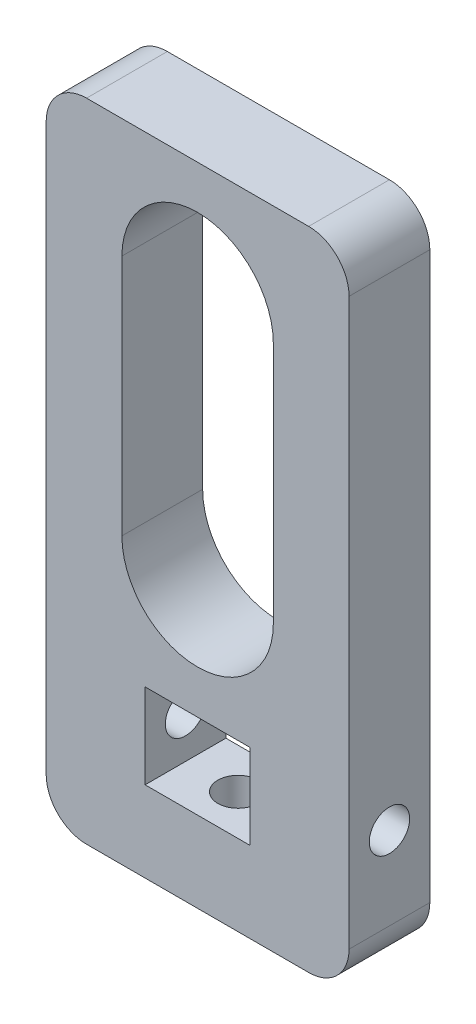
ISO-10303-21;
HEADER;
FILE_DESCRIPTION(('STEP AP214'),'2;1');
FILE_NAME('part.step','',(''),(''),'','','');
FILE_SCHEMA(('AUTOMOTIVE_DESIGN { 1 0 10303 214 1 1 1 1 }'));
ENDSEC;
DATA;
#1=APPLICATION_CONTEXT('core data for automotive mechanical design processes');
#2=APPLICATION_PROTOCOL_DEFINITION('international standard','automotive_design',2000,#1);
#3=PRODUCT_CONTEXT('',#1,'mechanical');
#4=PRODUCT('Part','Part','',(#3));
#5=PRODUCT_RELATED_PRODUCT_CATEGORY('part','',(#4));
#6=PRODUCT_DEFINITION_FORMATION('','',#4);
#7=PRODUCT_DEFINITION_CONTEXT('part definition',#1,'design');
#8=PRODUCT_DEFINITION('design','',#6,#7);
#9=PRODUCT_DEFINITION_SHAPE('','',#8);
#10=(LENGTH_UNIT() NAMED_UNIT(*) SI_UNIT(.MILLI.,.METRE.));
#11=(NAMED_UNIT(*) PLANE_ANGLE_UNIT() SI_UNIT($,.RADIAN.));
#12=(NAMED_UNIT(*) SI_UNIT($,.STERADIAN.) SOLID_ANGLE_UNIT());
#13=UNCERTAINTY_MEASURE_WITH_UNIT(LENGTH_MEASURE(1.E-05),#10,'distance_accuracy_value','');
#14=(GEOMETRIC_REPRESENTATION_CONTEXT(3) GLOBAL_UNCERTAINTY_ASSIGNED_CONTEXT((#13)) GLOBAL_UNIT_ASSIGNED_CONTEXT((#10,
#11,#12)) REPRESENTATION_CONTEXT('',''));
#15=CARTESIAN_POINT('',(0.,0.,0.));
#16=DIRECTION('',(0.,0.,1.));
#17=DIRECTION('',(1.,0.,0.));
#18=AXIS2_PLACEMENT_3D('',#15,#16,#17);
#19=CARTESIAN_POINT('',(5.08,-5.08,10.16));
#20=DIRECTION('',(0.,0.,1.));
#21=DIRECTION('',(1.,0.,0.));
#22=AXIS2_PLACEMENT_3D('',#19,#20,#21);
#23=PLANE('',#22);
#24=DIRECTION('',(0.,-1.,0.));
#25=VECTOR('',#24,1.);
#26=CARTESIAN_POINT('',(0.,0.,10.16));
#27=LINE('',#26,#25);
#28=CARTESIAN_POINT('',(0.,66.04,10.16));
#29=VERTEX_POINT('',#28);
#30=CARTESIAN_POINT('',(0.,-5.08,10.16));
#31=VERTEX_POINT('',#30);
#32=EDGE_CURVE('E215',#29,#31,#27,.T.);
#33=ORIENTED_EDGE('',*,*,#32,.T.);
#34=CARTESIAN_POINT('',(5.08,-5.08,10.16));
#35=DIRECTION('',(0.,0.,1.));
#36=DIRECTION('',(1.,0.,0.));
#37=AXIS2_PLACEMENT_3D('',#34,#35,#36);
#38=CIRCLE('',#37,5.08);
#39=CARTESIAN_POINT('',(5.08,-10.16,10.16));
#40=VERTEX_POINT('',#39);
#41=EDGE_CURVE('E218',#31,#40,#38,.T.);
#42=ORIENTED_EDGE('',*,*,#41,.T.);
#43=DIRECTION('',(1.,0.,0.));
#44=VECTOR('',#43,1.);
#45=CARTESIAN_POINT('',(5.08,-10.16,10.16));
#46=LINE('',#45,#44);
#47=CARTESIAN_POINT('',(33.02,-10.16,10.16));
#48=VERTEX_POINT('',#47);
#49=EDGE_CURVE('E221',#40,#48,#46,.T.);
#50=ORIENTED_EDGE('',*,*,#49,.T.);
#51=CARTESIAN_POINT('',(33.02,-5.08,10.16));
#52=DIRECTION('',(0.,0.,1.));
#53=DIRECTION('',(1.,0.,0.));
#54=AXIS2_PLACEMENT_3D('',#51,#52,#53);
#55=CIRCLE('',#54,5.08);
#56=CARTESIAN_POINT('',(38.1,-5.08,10.16));
#57=VERTEX_POINT('',#56);
#58=EDGE_CURVE('E223',#48,#57,#55,.T.);
#59=ORIENTED_EDGE('',*,*,#58,.T.);
#60=DIRECTION('',(0.,1.,0.));
#61=VECTOR('',#60,1.);
#62=CARTESIAN_POINT('',(38.1,-5.08,10.16));
#63=LINE('',#62,#61);
#64=CARTESIAN_POINT('',(38.1,66.04,10.16));
#65=VERTEX_POINT('',#64);
#66=EDGE_CURVE('E225',#57,#65,#63,.T.);
#67=ORIENTED_EDGE('',*,*,#66,.T.);
#68=CARTESIAN_POINT('',(33.02,66.04,10.16));
#69=DIRECTION('',(0.,0.,1.));
#70=DIRECTION('',(-1.,0.,0.));
#71=AXIS2_PLACEMENT_3D('',#68,#69,#70);
#72=CIRCLE('',#71,5.08000000000001);
#73=CARTESIAN_POINT('',(33.02,71.12,10.16));
#74=VERTEX_POINT('',#73);
#75=EDGE_CURVE('E227',#65,#74,#72,.T.);
#76=ORIENTED_EDGE('',*,*,#75,.T.);
#77=DIRECTION('',(-1.,0.,0.));
#78=VECTOR('',#77,1.);
#79=CARTESIAN_POINT('',(5.08,71.12,10.16));
#80=LINE('',#79,#78);
#81=CARTESIAN_POINT('',(5.08,71.12,10.16));
#82=VERTEX_POINT('',#81);
#83=EDGE_CURVE('E229',#74,#82,#80,.T.);
#84=ORIENTED_EDGE('',*,*,#83,.T.);
#85=CARTESIAN_POINT('',(5.08,66.04,10.16));
#86=DIRECTION('',(0.,0.,1.));
#87=DIRECTION('',(-1.,0.,0.));
#88=AXIS2_PLACEMENT_3D('',#85,#86,#87);
#89=CIRCLE('',#88,5.08000000000001);
#90=EDGE_CURVE('E231',#82,#29,#89,.T.);
#91=ORIENTED_EDGE('',*,*,#90,.T.);
#92=EDGE_LOOP('',(#33,#42,#50,#59,#67,#76,#84,#91));
#93=FACE_BOUND('',#92,.T.);
#94=DIRECTION('',(0.,-1.,0.));
#95=VECTOR('',#94,1.);
#96=CARTESIAN_POINT('',(9.525,56.134,10.16));
#97=LINE('',#96,#95);
#98=CARTESIAN_POINT('',(9.525,56.134,10.16));
#99=VERTEX_POINT('',#98);
#100=CARTESIAN_POINT('',(9.525,25.654,10.16));
#101=VERTEX_POINT('',#100);
#102=EDGE_CURVE('E186',#99,#101,#97,.T.);
#103=ORIENTED_EDGE('',*,*,#102,.F.);
#104=CARTESIAN_POINT('',(19.05,56.134,10.16));
#105=DIRECTION('',(0.,0.,1.));
#106=DIRECTION('',(-1.,0.,0.));
#107=AXIS2_PLACEMENT_3D('',#104,#105,#106);
#108=CIRCLE('',#107,9.525);
#109=CARTESIAN_POINT('',(28.575,56.134,10.16));
#110=VERTEX_POINT('',#109);
#111=EDGE_CURVE('E184',#110,#99,#108,.T.);
#112=ORIENTED_EDGE('',*,*,#111,.F.);
#113=DIRECTION('',(0.,1.,0.));
#114=VECTOR('',#113,1.);
#115=CARTESIAN_POINT('',(28.575,56.134,10.16));
#116=LINE('',#115,#114);
#117=CARTESIAN_POINT('',(28.575,25.654,10.16));
#118=VERTEX_POINT('',#117);
#119=EDGE_CURVE('E192',#118,#110,#116,.T.);
#120=ORIENTED_EDGE('',*,*,#119,.F.);
#121=CARTESIAN_POINT('',(19.05,25.654,10.16));
#122=DIRECTION('',(0.,0.,1.));
#123=DIRECTION('',(1.,0.,0.));
#124=AXIS2_PLACEMENT_3D('',#121,#122,#123);
#125=CIRCLE('',#124,9.525);
#126=EDGE_CURVE('E189',#101,#118,#125,.T.);
#127=ORIENTED_EDGE('',*,*,#126,.F.);
#128=EDGE_LOOP('',(#103,#112,#120,#127));
#129=FACE_BOUND('',#128,.T.);
#130=DIRECTION('',(0.,1.,0.));
#131=VECTOR('',#130,1.);
#132=CARTESIAN_POINT('',(25.654,10.668,10.16));
#133=LINE('',#132,#131);
#134=CARTESIAN_POINT('',(25.654,0.,10.16));
#135=VERTEX_POINT('',#134);
#136=CARTESIAN_POINT('',(25.654,10.668,10.16));
#137=VERTEX_POINT('',#136);
#138=EDGE_CURVE('E154',#135,#137,#133,.T.);
#139=ORIENTED_EDGE('',*,*,#138,.F.);
#140=DIRECTION('',(1.,0.,0.));
#141=VECTOR('',#140,1.);
#142=CARTESIAN_POINT('',(12.446,0.,10.16));
#143=LINE('',#142,#141);
#144=CARTESIAN_POINT('',(12.446,0.,10.16));
#145=VERTEX_POINT('',#144);
#146=EDGE_CURVE('E146',#145,#135,#143,.T.);
#147=ORIENTED_EDGE('',*,*,#146,.F.);
#148=DIRECTION('',(0.,-1.,0.));
#149=VECTOR('',#148,1.);
#150=CARTESIAN_POINT('',(12.446,0.,10.16));
#151=LINE('',#150,#149);
#152=CARTESIAN_POINT('',(12.446,10.668,10.16));
#153=VERTEX_POINT('',#152);
#154=EDGE_CURVE('E168',#153,#145,#151,.T.);
#155=ORIENTED_EDGE('',*,*,#154,.F.);
#156=DIRECTION('',(-1.,0.,0.));
#157=VECTOR('',#156,1.);
#158=CARTESIAN_POINT('',(12.446,10.668,10.16));
#159=LINE('',#158,#157);
#160=EDGE_CURVE('E166',#137,#153,#159,.T.);
#161=ORIENTED_EDGE('',*,*,#160,.F.);
#162=EDGE_LOOP('',(#139,#147,#155,#161));
#163=FACE_BOUND('',#162,.T.);
#164=ADVANCED_FACE('F32',(#93,#129,#163),#23,.T.);
#165=CARTESIAN_POINT('',(5.08,-5.08,0.));
#166=DIRECTION('',(0.,0.,1.));
#167=DIRECTION('',(1.,0.,0.));
#168=AXIS2_PLACEMENT_3D('',#165,#166,#167);
#169=PLANE('',#168);
#170=CARTESIAN_POINT('',(19.05,56.134,0.));
#171=DIRECTION('',(0.,0.,1.));
#172=DIRECTION('',(-1.,0.,0.));
#173=AXIS2_PLACEMENT_3D('',#170,#171,#172);
#174=CIRCLE('',#173,9.525);
#175=CARTESIAN_POINT('',(28.575,56.134,0.));
#176=VERTEX_POINT('',#175);
#177=CARTESIAN_POINT('',(9.525,56.134,0.));
#178=VERTEX_POINT('',#177);
#179=EDGE_CURVE('E162',#176,#178,#174,.T.);
#180=ORIENTED_EDGE('',*,*,#179,.T.);
#181=DIRECTION('',(0.,-1.,0.));
#182=VECTOR('',#181,1.);
#183=CARTESIAN_POINT('',(9.525,56.134,0.));
#184=LINE('',#183,#182);
#185=CARTESIAN_POINT('',(9.525,25.654,0.));
#186=VERTEX_POINT('',#185);
#187=EDGE_CURVE('E197',#178,#186,#184,.T.);
#188=ORIENTED_EDGE('',*,*,#187,.T.);
#189=CARTESIAN_POINT('',(19.05,25.654,0.));
#190=DIRECTION('',(0.,0.,1.));
#191=DIRECTION('',(1.,0.,0.));
#192=AXIS2_PLACEMENT_3D('',#189,#190,#191);
#193=CIRCLE('',#192,9.525);
#194=CARTESIAN_POINT('',(28.575,25.654,0.));
#195=VERTEX_POINT('',#194);
#196=EDGE_CURVE('E200',#186,#195,#193,.T.);
#197=ORIENTED_EDGE('',*,*,#196,.T.);
#198=DIRECTION('',(0.,1.,0.));
#199=VECTOR('',#198,1.);
#200=CARTESIAN_POINT('',(28.575,56.134,0.));
#201=LINE('',#200,#199);
#202=EDGE_CURVE('E187',#195,#176,#201,.T.);
#203=ORIENTED_EDGE('',*,*,#202,.T.);
#204=EDGE_LOOP('',(#180,#188,#197,#203));
#205=FACE_BOUND('',#204,.T.);
#206=CARTESIAN_POINT('',(5.08,-5.08,0.));
#207=DIRECTION('',(0.,0.,1.));
#208=DIRECTION('',(1.,0.,0.));
#209=AXIS2_PLACEMENT_3D('',#206,#207,#208);
#210=CIRCLE('',#209,5.08);
#211=CARTESIAN_POINT('',(0.,-5.08,0.));
#212=VERTEX_POINT('',#211);
#213=CARTESIAN_POINT('',(5.08,-10.16,0.));
#214=VERTEX_POINT('',#213);
#215=EDGE_CURVE('E214',#212,#214,#210,.T.);
#216=ORIENTED_EDGE('',*,*,#215,.F.);
#217=DIRECTION('',(0.,-1.,0.));
#218=VECTOR('',#217,1.);
#219=CARTESIAN_POINT('',(0.,0.,0.));
#220=LINE('',#219,#218);
#221=CARTESIAN_POINT('',(0.,66.04,0.));
#222=VERTEX_POINT('',#221);
#223=EDGE_CURVE('E219',#222,#212,#220,.T.);
#224=ORIENTED_EDGE('',*,*,#223,.F.);
#225=CARTESIAN_POINT('',(5.08,66.04,0.));
#226=DIRECTION('',(0.,0.,1.));
#227=DIRECTION('',(-1.,0.,0.));
#228=AXIS2_PLACEMENT_3D('',#225,#226,#227);
#229=CIRCLE('',#228,5.08000000000001);
#230=CARTESIAN_POINT('',(5.08,71.12,0.));
#231=VERTEX_POINT('',#230);
#232=EDGE_CURVE('E247',#231,#222,#229,.T.);
#233=ORIENTED_EDGE('',*,*,#232,.F.);
#234=DIRECTION('',(-1.,0.,0.));
#235=VECTOR('',#234,1.);
#236=CARTESIAN_POINT('',(5.08,71.12,0.));
#237=LINE('',#236,#235);
#238=CARTESIAN_POINT('',(33.02,71.12,0.));
#239=VERTEX_POINT('',#238);
#240=EDGE_CURVE('E245',#239,#231,#237,.T.);
#241=ORIENTED_EDGE('',*,*,#240,.F.);
#242=CARTESIAN_POINT('',(33.02,66.04,0.));
#243=DIRECTION('',(0.,0.,1.));
#244=DIRECTION('',(-1.,0.,0.));
#245=AXIS2_PLACEMENT_3D('',#242,#243,#244);
#246=CIRCLE('',#245,5.08000000000001);
#247=CARTESIAN_POINT('',(38.1,66.04,0.));
#248=VERTEX_POINT('',#247);
#249=EDGE_CURVE('E243',#248,#239,#246,.T.);
#250=ORIENTED_EDGE('',*,*,#249,.F.);
#251=DIRECTION('',(0.,1.,0.));
#252=VECTOR('',#251,1.);
#253=CARTESIAN_POINT('',(38.1,0.,0.));
#254=LINE('',#253,#252);
#255=CARTESIAN_POINT('',(38.1,-5.08,0.));
#256=VERTEX_POINT('',#255);
#257=EDGE_CURVE('E241',#256,#248,#254,.T.);
#258=ORIENTED_EDGE('',*,*,#257,.F.);
#259=CARTESIAN_POINT('',(33.02,-5.08,0.));
#260=DIRECTION('',(0.,0.,1.));
#261=DIRECTION('',(1.,0.,0.));
#262=AXIS2_PLACEMENT_3D('',#259,#260,#261);
#263=CIRCLE('',#262,5.08);
#264=CARTESIAN_POINT('',(33.02,-10.16,0.));
#265=VERTEX_POINT('',#264);
#266=EDGE_CURVE('E238',#265,#256,#263,.T.);
#267=ORIENTED_EDGE('',*,*,#266,.F.);
#268=DIRECTION('',(1.,0.,0.));
#269=VECTOR('',#268,1.);
#270=CARTESIAN_POINT('',(5.08,-10.16,0.));
#271=LINE('',#270,#269);
#272=EDGE_CURVE('E236',#214,#265,#271,.T.);
#273=ORIENTED_EDGE('',*,*,#272,.F.);
#274=EDGE_LOOP('',(#216,#224,#233,#241,#250,#258,#267,#273));
#275=FACE_BOUND('',#274,.T.);
#276=DIRECTION('',(1.,0.,0.));
#277=VECTOR('',#276,1.);
#278=CARTESIAN_POINT('',(12.446,0.,0.));
#279=LINE('',#278,#277);
#280=CARTESIAN_POINT('',(12.446,0.,0.));
#281=VERTEX_POINT('',#280);
#282=CARTESIAN_POINT('',(25.654,0.,0.));
#283=VERTEX_POINT('',#282);
#284=EDGE_CURVE('E56',#281,#283,#279,.T.);
#285=ORIENTED_EDGE('',*,*,#284,.T.);
#286=DIRECTION('',(0.,1.,0.));
#287=VECTOR('',#286,1.);
#288=CARTESIAN_POINT('',(25.654,10.668,0.));
#289=LINE('',#288,#287);
#290=CARTESIAN_POINT('',(25.654,10.668,0.));
#291=VERTEX_POINT('',#290);
#292=EDGE_CURVE('E161',#283,#291,#289,.T.);
#293=ORIENTED_EDGE('',*,*,#292,.T.);
#294=DIRECTION('',(-1.,0.,0.));
#295=VECTOR('',#294,1.);
#296=CARTESIAN_POINT('',(12.446,10.668,0.));
#297=LINE('',#296,#295);
#298=CARTESIAN_POINT('',(12.446,10.668,0.));
#299=VERTEX_POINT('',#298);
#300=EDGE_CURVE('E176',#291,#299,#297,.T.);
#301=ORIENTED_EDGE('',*,*,#300,.T.);
#302=DIRECTION('',(0.,-1.,0.));
#303=VECTOR('',#302,1.);
#304=CARTESIAN_POINT('',(12.446,0.,0.));
#305=LINE('',#304,#303);
#306=EDGE_CURVE('E155',#299,#281,#305,.T.);
#307=ORIENTED_EDGE('',*,*,#306,.T.);
#308=EDGE_LOOP('',(#285,#293,#301,#307));
#309=FACE_BOUND('',#308,.T.);
#310=ADVANCED_FACE('F278',(#205,#275,#309),#169,.F.);
#311=CARTESIAN_POINT('',(5.08,-5.08,10.16));
#312=DIRECTION('',(0.,0.,-1.));
#313=DIRECTION('',(-1.,0.,0.));
#314=AXIS2_PLACEMENT_3D('',#311,#312,#313);
#315=CYLINDRICAL_SURFACE('',#314,5.08);
#316=ORIENTED_EDGE('',*,*,#215,.T.);
#317=DIRECTION('',(0.,0.,-1.));
#318=VECTOR('',#317,1.);
#319=CARTESIAN_POINT('',(5.08,-10.16,10.16));
#320=LINE('',#319,#318);
#321=EDGE_CURVE('E41',#40,#214,#320,.T.);
#322=ORIENTED_EDGE('',*,*,#321,.F.);
#323=ORIENTED_EDGE('',*,*,#41,.F.);
#324=DIRECTION('',(0.,0.,-1.));
#325=VECTOR('',#324,1.);
#326=CARTESIAN_POINT('',(0.,-5.08,10.16));
#327=LINE('',#326,#325);
#328=EDGE_CURVE('E11',#31,#212,#327,.T.);
#329=ORIENTED_EDGE('',*,*,#328,.T.);
#330=EDGE_LOOP('',(#316,#322,#323,#329));
#331=FACE_BOUND('',#330,.T.);
#332=ADVANCED_FACE('F34',(#331),#315,.T.);
#333=CARTESIAN_POINT('',(5.08,-10.16,10.16));
#334=DIRECTION('',(0.,1.,0.));
#335=DIRECTION('',(0.,0.,1.));
#336=AXIS2_PLACEMENT_3D('',#333,#334,#335);
#337=PLANE('',#336);
#338=CARTESIAN_POINT('',(19.05,-10.16,5.08));
#339=DIRECTION('',(0.,-1.,0.));
#340=DIRECTION('',(0.,0.,-1.));
#341=AXIS2_PLACEMENT_3D('',#338,#339,#340);
#342=CIRCLE('',#341,2.54);
#343=CARTESIAN_POINT('',(19.05,-10.16,2.54));
#344=VERTEX_POINT('',#343);
#345=EDGE_CURVE('E506',#344,#344,#342,.T.);
#346=ORIENTED_EDGE('',*,*,#345,.F.);
#347=EDGE_LOOP('',(#346));
#348=FACE_BOUND('',#347,.T.);
#349=ORIENTED_EDGE('',*,*,#272,.T.);
#350=DIRECTION('',(0.,0.,-1.));
#351=VECTOR('',#350,1.);
#352=CARTESIAN_POINT('',(33.02,-10.16,10.16));
#353=LINE('',#352,#351);
#354=EDGE_CURVE('E264',#48,#265,#353,.T.);
#355=ORIENTED_EDGE('',*,*,#354,.F.);
#356=ORIENTED_EDGE('',*,*,#49,.F.);
#357=ORIENTED_EDGE('',*,*,#321,.T.);
#358=EDGE_LOOP('',(#349,#355,#356,#357));
#359=FACE_BOUND('',#358,.T.);
#360=ADVANCED_FACE('F272',(#348,#359),#337,.F.);
#361=CARTESIAN_POINT('',(33.02,-5.08,10.16));
#362=DIRECTION('',(0.,0.,-1.));
#363=DIRECTION('',(-1.,0.,0.));
#364=AXIS2_PLACEMENT_3D('',#361,#362,#363);
#365=CYLINDRICAL_SURFACE('',#364,5.08);
#366=ORIENTED_EDGE('',*,*,#266,.T.);
#367=DIRECTION('',(0.,0.,-1.));
#368=VECTOR('',#367,1.);
#369=CARTESIAN_POINT('',(38.1,-5.08,10.16));
#370=LINE('',#369,#368);
#371=EDGE_CURVE('E261',#57,#256,#370,.T.);
#372=ORIENTED_EDGE('',*,*,#371,.F.);
#373=ORIENTED_EDGE('',*,*,#58,.F.);
#374=ORIENTED_EDGE('',*,*,#354,.T.);
#375=EDGE_LOOP('',(#366,#372,#373,#374));
#376=FACE_BOUND('',#375,.T.);
#377=ADVANCED_FACE('F284',(#376),#365,.T.);
#378=CARTESIAN_POINT('',(38.1,0.,10.16));
#379=DIRECTION('',(-1.,0.,0.));
#380=DIRECTION('',(0.,-1.,0.));
#381=AXIS2_PLACEMENT_3D('',#378,#379,#380);
#382=PLANE('',#381);
#383=CARTESIAN_POINT('',(38.1,5.334,5.08));
#384=DIRECTION('',(-1.,0.,0.));
#385=DIRECTION('',(0.,0.,1.));
#386=AXIS2_PLACEMENT_3D('',#383,#384,#385);
#387=CIRCLE('',#386,2.54);
#388=CARTESIAN_POINT('',(38.1,5.334,7.62));
#389=VERTEX_POINT('',#388);
#390=EDGE_CURVE('E514',#389,#389,#387,.T.);
#391=ORIENTED_EDGE('',*,*,#390,.T.);
#392=EDGE_LOOP('',(#391));
#393=FACE_BOUND('',#392,.T.);
#394=ORIENTED_EDGE('',*,*,#257,.T.);
#395=DIRECTION('',(0.,0.,-1.));
#396=VECTOR('',#395,1.);
#397=CARTESIAN_POINT('',(38.1,66.04,10.16));
#398=LINE('',#397,#396);
#399=EDGE_CURVE('E258',#65,#248,#398,.T.);
#400=ORIENTED_EDGE('',*,*,#399,.F.);
#401=ORIENTED_EDGE('',*,*,#66,.F.);
#402=ORIENTED_EDGE('',*,*,#371,.T.);
#403=EDGE_LOOP('',(#394,#400,#401,#402));
#404=FACE_BOUND('',#403,.T.);
#405=ADVANCED_FACE('F288',(#393,#404),#382,.F.);
#406=CARTESIAN_POINT('',(33.02,66.04,10.16));
#407=DIRECTION('',(0.,0.,-1.));
#408=DIRECTION('',(-1.,0.,0.));
#409=AXIS2_PLACEMENT_3D('',#406,#407,#408);
#410=CYLINDRICAL_SURFACE('',#409,5.08000000000001);
#411=ORIENTED_EDGE('',*,*,#249,.T.);
#412=DIRECTION('',(0.,0.,-1.));
#413=VECTOR('',#412,1.);
#414=CARTESIAN_POINT('',(33.02,71.12,10.16));
#415=LINE('',#414,#413);
#416=EDGE_CURVE('E255',#74,#239,#415,.T.);
#417=ORIENTED_EDGE('',*,*,#416,.F.);
#418=ORIENTED_EDGE('',*,*,#75,.F.);
#419=ORIENTED_EDGE('',*,*,#399,.T.);
#420=EDGE_LOOP('',(#411,#417,#418,#419));
#421=FACE_BOUND('',#420,.T.);
#422=ADVANCED_FACE('F308',(#421),#410,.T.);
#423=CARTESIAN_POINT('',(5.08,71.12,10.16));
#424=DIRECTION('',(0.,-1.,0.));
#425=DIRECTION('',(0.,0.,-1.));
#426=AXIS2_PLACEMENT_3D('',#423,#424,#425);
#427=PLANE('',#426);
#428=ORIENTED_EDGE('',*,*,#240,.T.);
#429=DIRECTION('',(0.,0.,-1.));
#430=VECTOR('',#429,1.);
#431=CARTESIAN_POINT('',(5.08,71.12,10.16));
#432=LINE('',#431,#430);
#433=EDGE_CURVE('E252',#82,#231,#432,.T.);
#434=ORIENTED_EDGE('',*,*,#433,.F.);
#435=ORIENTED_EDGE('',*,*,#83,.F.);
#436=ORIENTED_EDGE('',*,*,#416,.T.);
#437=EDGE_LOOP('',(#428,#434,#435,#436));
#438=FACE_BOUND('',#437,.T.);
#439=ADVANCED_FACE('F306',(#438),#427,.F.);
#440=CARTESIAN_POINT('',(5.08,66.04,10.16));
#441=DIRECTION('',(0.,0.,-1.));
#442=DIRECTION('',(-1.,0.,0.));
#443=AXIS2_PLACEMENT_3D('',#440,#441,#442);
#444=CYLINDRICAL_SURFACE('',#443,5.08000000000001);
#445=ORIENTED_EDGE('',*,*,#232,.T.);
#446=DIRECTION('',(0.,0.,-1.));
#447=VECTOR('',#446,1.);
#448=CARTESIAN_POINT('',(0.,66.04,10.16));
#449=LINE('',#448,#447);
#450=EDGE_CURVE('E234',#29,#222,#449,.T.);
#451=ORIENTED_EDGE('',*,*,#450,.F.);
#452=ORIENTED_EDGE('',*,*,#90,.F.);
#453=ORIENTED_EDGE('',*,*,#433,.T.);
#454=EDGE_LOOP('',(#445,#451,#452,#453));
#455=FACE_BOUND('',#454,.T.);
#456=ADVANCED_FACE('F301',(#455),#444,.T.);
#457=CARTESIAN_POINT('',(0.,0.,10.16));
#458=DIRECTION('',(1.,0.,0.));
#459=DIRECTION('',(0.,0.,-1.));
#460=AXIS2_PLACEMENT_3D('',#457,#458,#459);
#461=PLANE('',#460);
#462=CARTESIAN_POINT('',(0.,5.334,5.08));
#463=DIRECTION('',(-1.,0.,0.));
#464=DIRECTION('',(0.,0.,1.));
#465=AXIS2_PLACEMENT_3D('',#462,#463,#464);
#466=CIRCLE('',#465,2.54);
#467=CARTESIAN_POINT('',(0.,5.334,7.62));
#468=VERTEX_POINT('',#467);
#469=EDGE_CURVE('E511',#468,#468,#466,.T.);
#470=ORIENTED_EDGE('',*,*,#469,.F.);
#471=EDGE_LOOP('',(#470));
#472=FACE_BOUND('',#471,.T.);
#473=ORIENTED_EDGE('',*,*,#223,.T.);
#474=ORIENTED_EDGE('',*,*,#328,.F.);
#475=ORIENTED_EDGE('',*,*,#32,.F.);
#476=ORIENTED_EDGE('',*,*,#450,.T.);
#477=EDGE_LOOP('',(#473,#474,#475,#476));
#478=FACE_BOUND('',#477,.T.);
#479=ADVANCED_FACE('F296',(#472,#478),#461,.F.);
#480=CARTESIAN_POINT('',(19.05,56.134,10.16));
#481=DIRECTION('',(0.,0.,-1.));
#482=DIRECTION('',(-1.,0.,0.));
#483=AXIS2_PLACEMENT_3D('',#480,#481,#482);
#484=CYLINDRICAL_SURFACE('',#483,9.525);
#485=ORIENTED_EDGE('',*,*,#179,.F.);
#486=DIRECTION('',(0.,0.,-1.));
#487=VECTOR('',#486,1.);
#488=CARTESIAN_POINT('',(28.575,56.134,10.16));
#489=LINE('',#488,#487);
#490=EDGE_CURVE('E194',#110,#176,#489,.T.);
#491=ORIENTED_EDGE('',*,*,#490,.F.);
#492=ORIENTED_EDGE('',*,*,#111,.T.);
#493=DIRECTION('',(0.,0.,-1.));
#494=VECTOR('',#493,1.);
#495=CARTESIAN_POINT('',(9.525,56.134,10.16));
#496=LINE('',#495,#494);
#497=EDGE_CURVE('E211',#99,#178,#496,.T.);
#498=ORIENTED_EDGE('',*,*,#497,.T.);
#499=EDGE_LOOP('',(#485,#491,#492,#498));
#500=FACE_BOUND('',#499,.T.);
#501=ADVANCED_FACE('F326',(#500),#484,.F.);
#502=CARTESIAN_POINT('',(9.525,56.134,10.16));
#503=DIRECTION('',(1.,0.,0.));
#504=DIRECTION('',(0.,1.,0.));
#505=AXIS2_PLACEMENT_3D('',#502,#503,#504);
#506=PLANE('',#505);
#507=ORIENTED_EDGE('',*,*,#187,.F.);
#508=ORIENTED_EDGE('',*,*,#497,.F.);
#509=ORIENTED_EDGE('',*,*,#102,.T.);
#510=DIRECTION('',(0.,0.,-1.));
#511=VECTOR('',#510,1.);
#512=CARTESIAN_POINT('',(9.525,25.654,10.16));
#513=LINE('',#512,#511);
#514=EDGE_CURVE('E209',#101,#186,#513,.T.);
#515=ORIENTED_EDGE('',*,*,#514,.T.);
#516=EDGE_LOOP('',(#507,#508,#509,#515));
#517=FACE_BOUND('',#516,.T.);
#518=ADVANCED_FACE('F349',(#517),#506,.T.);
#519=CARTESIAN_POINT('',(19.05,25.654,10.16));
#520=DIRECTION('',(0.,0.,-1.));
#521=DIRECTION('',(-1.,0.,0.));
#522=AXIS2_PLACEMENT_3D('',#519,#520,#521);
#523=CYLINDRICAL_SURFACE('',#522,9.525);
#524=ORIENTED_EDGE('',*,*,#196,.F.);
#525=ORIENTED_EDGE('',*,*,#514,.F.);
#526=ORIENTED_EDGE('',*,*,#126,.T.);
#527=DIRECTION('',(0.,0.,-1.));
#528=VECTOR('',#527,1.);
#529=CARTESIAN_POINT('',(28.575,25.654,10.16));
#530=LINE('',#529,#528);
#531=EDGE_CURVE('E207',#118,#195,#530,.T.);
#532=ORIENTED_EDGE('',*,*,#531,.T.);
#533=EDGE_LOOP('',(#524,#525,#526,#532));
#534=FACE_BOUND('',#533,.T.);
#535=ADVANCED_FACE('F356',(#534),#523,.F.);
#536=CARTESIAN_POINT('',(28.575,56.134,10.16));
#537=DIRECTION('',(-1.,0.,0.));
#538=DIRECTION('',(0.,0.,1.));
#539=AXIS2_PLACEMENT_3D('',#536,#537,#538);
#540=PLANE('',#539);
#541=ORIENTED_EDGE('',*,*,#202,.F.);
#542=ORIENTED_EDGE('',*,*,#531,.F.);
#543=ORIENTED_EDGE('',*,*,#119,.T.);
#544=ORIENTED_EDGE('',*,*,#490,.T.);
#545=EDGE_LOOP('',(#541,#542,#543,#544));
#546=FACE_BOUND('',#545,.T.);
#547=ADVANCED_FACE('F363',(#546),#540,.T.);
#548=CARTESIAN_POINT('',(12.446,0.,10.16));
#549=DIRECTION('',(0.,1.,0.));
#550=DIRECTION('',(0.,0.,1.));
#551=AXIS2_PLACEMENT_3D('',#548,#549,#550);
#552=PLANE('',#551);
#553=CARTESIAN_POINT('',(19.05,0.,5.08));
#554=DIRECTION('',(0.,-1.,0.));
#555=DIRECTION('',(0.,0.,-1.));
#556=AXIS2_PLACEMENT_3D('',#553,#554,#555);
#557=CIRCLE('',#556,2.54);
#558=CARTESIAN_POINT('',(19.05,0.,2.54));
#559=VERTEX_POINT('',#558);
#560=EDGE_CURVE('E508',#559,#559,#557,.T.);
#561=ORIENTED_EDGE('',*,*,#560,.T.);
#562=EDGE_LOOP('',(#561));
#563=FACE_BOUND('',#562,.T.);
#564=ORIENTED_EDGE('',*,*,#284,.F.);
#565=DIRECTION('',(0.,0.,-1.));
#566=VECTOR('',#565,1.);
#567=CARTESIAN_POINT('',(12.446,0.,10.16));
#568=LINE('',#567,#566);
#569=EDGE_CURVE('E150',#145,#281,#568,.T.);
#570=ORIENTED_EDGE('',*,*,#569,.F.);
#571=ORIENTED_EDGE('',*,*,#146,.T.);
#572=DIRECTION('',(0.,0.,-1.));
#573=VECTOR('',#572,1.);
#574=CARTESIAN_POINT('',(25.654,0.,10.16));
#575=LINE('',#574,#573);
#576=EDGE_CURVE('E149',#135,#283,#575,.T.);
#577=ORIENTED_EDGE('',*,*,#576,.T.);
#578=EDGE_LOOP('',(#564,#570,#571,#577));
#579=FACE_BOUND('',#578,.T.);
#580=ADVANCED_FACE('F148',(#563,#579),#552,.T.);
#581=CARTESIAN_POINT('',(25.654,10.668,10.16));
#582=DIRECTION('',(-1.,0.,0.));
#583=DIRECTION('',(0.,0.,1.));
#584=AXIS2_PLACEMENT_3D('',#581,#582,#583);
#585=PLANE('',#584);
#586=CARTESIAN_POINT('',(25.654,5.334,5.08));
#587=DIRECTION('',(-1.,0.,0.));
#588=DIRECTION('',(0.,0.,1.));
#589=AXIS2_PLACEMENT_3D('',#586,#587,#588);
#590=CIRCLE('',#589,2.54);
#591=CARTESIAN_POINT('',(25.654,5.334,7.62));
#592=VERTEX_POINT('',#591);
#593=EDGE_CURVE('E174',#592,#592,#590,.T.);
#594=ORIENTED_EDGE('',*,*,#593,.F.);
#595=EDGE_LOOP('',(#594));
#596=FACE_BOUND('',#595,.T.);
#597=ORIENTED_EDGE('',*,*,#292,.F.);
#598=ORIENTED_EDGE('',*,*,#576,.F.);
#599=ORIENTED_EDGE('',*,*,#138,.T.);
#600=DIRECTION('',(0.,0.,-1.));
#601=VECTOR('',#600,1.);
#602=CARTESIAN_POINT('',(25.654,10.668,10.16));
#603=LINE('',#602,#601);
#604=EDGE_CURVE('E163',#137,#291,#603,.T.);
#605=ORIENTED_EDGE('',*,*,#604,.T.);
#606=EDGE_LOOP('',(#597,#598,#599,#605));
#607=FACE_BOUND('',#606,.T.);
#608=ADVANCED_FACE('F158',(#596,#607),#585,.T.);
#609=CARTESIAN_POINT('',(12.446,10.668,10.16));
#610=DIRECTION('',(0.,-1.,0.));
#611=DIRECTION('',(1.,0.,0.));
#612=AXIS2_PLACEMENT_3D('',#609,#610,#611);
#613=PLANE('',#612);
#614=ORIENTED_EDGE('',*,*,#300,.F.);
#615=ORIENTED_EDGE('',*,*,#604,.F.);
#616=ORIENTED_EDGE('',*,*,#160,.T.);
#617=DIRECTION('',(0.,0.,-1.));
#618=VECTOR('',#617,1.);
#619=CARTESIAN_POINT('',(12.446,10.668,10.16));
#620=LINE('',#619,#618);
#621=EDGE_CURVE('E48',#153,#299,#620,.T.);
#622=ORIENTED_EDGE('',*,*,#621,.T.);
#623=EDGE_LOOP('',(#614,#615,#616,#622));
#624=FACE_BOUND('',#623,.T.);
#625=ADVANCED_FACE('F387',(#624),#613,.T.);
#626=CARTESIAN_POINT('',(12.446,0.,10.16));
#627=DIRECTION('',(1.,0.,0.));
#628=DIRECTION('',(0.,0.,-1.));
#629=AXIS2_PLACEMENT_3D('',#626,#627,#628);
#630=PLANE('',#629);
#631=CARTESIAN_POINT('',(12.446,5.334,5.08));
#632=DIRECTION('',(1.,0.,0.));
#633=DIRECTION('',(0.,0.,-1.));
#634=AXIS2_PLACEMENT_3D('',#631,#632,#633);
#635=CIRCLE('',#634,2.54);
#636=CARTESIAN_POINT('',(12.446,5.334,7.62));
#637=VERTEX_POINT('',#636);
#638=EDGE_CURVE('E36',#637,#637,#635,.T.);
#639=ORIENTED_EDGE('',*,*,#638,.F.);
#640=EDGE_LOOP('',(#639));
#641=FACE_BOUND('',#640,.T.);
#642=ORIENTED_EDGE('',*,*,#306,.F.);
#643=ORIENTED_EDGE('',*,*,#621,.F.);
#644=ORIENTED_EDGE('',*,*,#154,.T.);
#645=ORIENTED_EDGE('',*,*,#569,.T.);
#646=EDGE_LOOP('',(#642,#643,#644,#645));
#647=FACE_BOUND('',#646,.T.);
#648=ADVANCED_FACE('F395',(#641,#647),#630,.T.);
#649=CARTESIAN_POINT('',(38.1,5.334,5.08));
#650=DIRECTION('',(-1.,0.,0.));
#651=DIRECTION('',(0.,0.,1.));
#652=AXIS2_PLACEMENT_3D('',#649,#650,#651);
#653=CYLINDRICAL_SURFACE('',#652,2.54);
#654=CARTESIAN_POINT('',(12.446,5.334,7.62));
#655=CARTESIAN_POINT('',(12.3163541666667,5.334,7.62));
#656=CARTESIAN_POINT('',(12.1867083333333,5.334,7.62));
#657=CARTESIAN_POINT('',(11.9274166666667,5.334,7.62));
#658=CARTESIAN_POINT('',(11.7977708333333,5.334,7.62));
#659=CARTESIAN_POINT('',(11.5384791666667,5.334,7.62));
#660=CARTESIAN_POINT('',(11.4088333333333,5.334,7.62));
#661=CARTESIAN_POINT('',(11.1495416666667,5.334,7.62));
#662=CARTESIAN_POINT('',(11.0198958333333,5.334,7.62));
#663=CARTESIAN_POINT('',(10.7606041666667,5.334,7.62));
#664=CARTESIAN_POINT('',(10.6309583333333,5.334,7.62));
#665=CARTESIAN_POINT('',(10.3716666666667,5.334,7.62));
#666=CARTESIAN_POINT('',(10.2420208333333,5.334,7.62));
#667=CARTESIAN_POINT('',(9.98272916666667,5.334,7.62));
#668=CARTESIAN_POINT('',(9.85308333333333,5.334,7.62));
#669=CARTESIAN_POINT('',(9.59379166666667,5.334,7.62));
#670=CARTESIAN_POINT('',(9.46414583333333,5.334,7.62));
#671=CARTESIAN_POINT('',(9.20485416666667,5.334,7.62));
#672=CARTESIAN_POINT('',(9.07520833333333,5.334,7.62));
#673=CARTESIAN_POINT('',(8.81591666666667,5.334,7.62));
#674=CARTESIAN_POINT('',(8.68627083333333,5.334,7.62));
#675=CARTESIAN_POINT('',(8.42697916666667,5.334,7.62));
#676=CARTESIAN_POINT('',(8.29733333333333,5.334,7.62));
#677=CARTESIAN_POINT('',(8.03804166666667,5.334,7.62));
#678=CARTESIAN_POINT('',(7.90839583333333,5.334,7.62));
#679=CARTESIAN_POINT('',(7.64910416666667,5.334,7.62));
#680=CARTESIAN_POINT('',(7.51945833333333,5.334,7.62));
#681=CARTESIAN_POINT('',(7.26016666666667,5.334,7.62));
#682=CARTESIAN_POINT('',(7.13052083333333,5.334,7.62));
#683=CARTESIAN_POINT('',(6.87122916666667,5.334,7.62));
#684=CARTESIAN_POINT('',(6.74158333333334,5.334,7.62));
#685=CARTESIAN_POINT('',(6.48229166666667,5.334,7.62));
#686=CARTESIAN_POINT('',(6.35264583333334,5.334,7.62));
#687=CARTESIAN_POINT('',(6.09335416666667,5.334,7.62));
#688=CARTESIAN_POINT('',(5.96370833333334,5.334,7.62));
#689=CARTESIAN_POINT('',(5.70441666666667,5.334,7.62));
#690=CARTESIAN_POINT('',(5.57477083333333,5.334,7.62));
#691=CARTESIAN_POINT('',(5.31547916666667,5.334,7.62));
#692=CARTESIAN_POINT('',(5.18583333333334,5.334,7.62));
#693=CARTESIAN_POINT('',(4.92654166666667,5.334,7.62));
#694=CARTESIAN_POINT('',(4.79689583333334,5.334,7.62));
#695=CARTESIAN_POINT('',(4.53760416666667,5.334,7.62));
#696=CARTESIAN_POINT('',(4.40795833333334,5.334,7.62));
#697=CARTESIAN_POINT('',(4.14866666666667,5.334,7.62));
#698=CARTESIAN_POINT('',(4.01902083333334,5.334,7.62));
#699=CARTESIAN_POINT('',(3.75972916666667,5.334,7.62));
#700=CARTESIAN_POINT('',(3.63008333333333,5.334,7.62));
#701=CARTESIAN_POINT('',(3.37079166666667,5.334,7.62));
#702=CARTESIAN_POINT('',(3.24114583333334,5.334,7.62));
#703=CARTESIAN_POINT('',(2.98185416666667,5.334,7.62));
#704=CARTESIAN_POINT('',(2.85220833333333,5.334,7.62));
#705=CARTESIAN_POINT('',(2.59291666666666,5.334,7.62));
#706=CARTESIAN_POINT('',(2.46327083333333,5.334,7.62));
#707=CARTESIAN_POINT('',(2.20397916666667,5.334,7.62));
#708=CARTESIAN_POINT('',(2.07433333333333,5.334,7.62));
#709=CARTESIAN_POINT('',(1.81504166666667,5.334,7.62));
#710=CARTESIAN_POINT('',(1.68539583333333,5.334,7.62));
#711=CARTESIAN_POINT('',(1.42610416666667,5.334,7.62));
#712=CARTESIAN_POINT('',(1.29645833333334,5.334,7.62));
#713=CARTESIAN_POINT('',(1.03716666666667,5.334,7.62));
#714=CARTESIAN_POINT('',(0.907520833333333,5.334,7.62));
#715=CARTESIAN_POINT('',(0.648229166666664,5.334,7.62));
#716=CARTESIAN_POINT('',(0.518583333333332,5.334,7.62));
#717=CARTESIAN_POINT('',(0.259291666666666,5.334,7.62));
#718=CARTESIAN_POINT('',(0.129645833333333,5.334,7.62));
#719=CARTESIAN_POINT('',(0.,5.334,7.62));
#720=B_SPLINE_CURVE_WITH_KNOTS('',3,(#654,#655,#656,#657,#658,#659,#660,#661,#662,#663,#664,
#665,#666,#667,#668,#669,#670,#671,#672,#673,#674,#675,#676,#677,#678,#679,#680,#681,#682,#683,
#684,#685,#686,#687,#688,#689,#690,#691,#692,#693,#694,#695,#696,#697,#698,#699,#700,#701,#702,
#703,#704,#705,#706,#707,#708,#709,#710,#711,#712,#713,#714,#715,#716,#717,#718,#719),
.UNSPECIFIED.,.F.,.F.,(4,2,2,2,2,2,2,2,2,2,2,2,2,2,2,2,2,2,2,2,2,2,2,2,2,2,2,2,2,2,2,2,4),(0.,
0.388937499999999,0.777875000000001,1.1668125,1.55575,1.9446875,2.333625,2.7225625,3.1115,
3.5004375,3.889375,4.2783125,4.66725,5.0561875,5.445125,5.8340625,6.223,6.6119375,7.000875,
7.3898125,7.77875,8.1676875,8.556625,8.9455625,9.3345,9.7234375,10.112375,10.5013125,10.89025,
11.2791875,11.668125,12.0570625,12.446),.UNSPECIFIED.);
#721=EDGE_CURVE('BSEAM402',#637,#468,#720,.T.);
#722=ORIENTED_EDGE('',*,*,#638,.T.);
#723=ORIENTED_EDGE('',*,*,#469,.T.);
#724=ORIENTED_EDGE('',*,*,#721,.T.);
#725=ORIENTED_EDGE('',*,*,#721,.F.);
#726=EDGE_LOOP('',(#722,#724,#723,#725));
#727=FACE_BOUND('',#726,.T.);
#728=ADVANCED_FACE('F402',(#727),#653,.F.);
#729=CARTESIAN_POINT('',(25.654,5.334,7.62));
#730=CARTESIAN_POINT('',(25.7836458333333,5.334,7.62));
#731=CARTESIAN_POINT('',(25.9132916666667,5.334,7.62));
#732=CARTESIAN_POINT('',(26.1725833333333,5.334,7.62));
#733=CARTESIAN_POINT('',(26.3022291666667,5.334,7.62));
#734=CARTESIAN_POINT('',(26.5615208333333,5.334,7.62));
#735=CARTESIAN_POINT('',(26.6911666666667,5.334,7.62));
#736=CARTESIAN_POINT('',(26.9504583333333,5.334,7.62));
#737=CARTESIAN_POINT('',(27.0801041666667,5.334,7.62));
#738=CARTESIAN_POINT('',(27.3393958333333,5.334,7.62));
#739=CARTESIAN_POINT('',(27.4690416666667,5.334,7.62));
#740=CARTESIAN_POINT('',(27.7283333333333,5.334,7.62));
#741=CARTESIAN_POINT('',(27.8579791666667,5.334,7.62));
#742=CARTESIAN_POINT('',(28.1172708333333,5.334,7.62));
#743=CARTESIAN_POINT('',(28.2469166666667,5.334,7.62));
#744=CARTESIAN_POINT('',(28.5062083333333,5.334,7.62));
#745=CARTESIAN_POINT('',(28.6358541666667,5.334,7.62));
#746=CARTESIAN_POINT('',(28.8951458333333,5.334,7.62));
#747=CARTESIAN_POINT('',(29.0247916666667,5.334,7.62));
#748=CARTESIAN_POINT('',(29.2840833333333,5.334,7.62));
#749=CARTESIAN_POINT('',(29.4137291666667,5.334,7.62));
#750=CARTESIAN_POINT('',(29.6730208333333,5.334,7.62));
#751=CARTESIAN_POINT('',(29.8026666666667,5.334,7.62));
#752=CARTESIAN_POINT('',(30.0619583333333,5.334,7.62));
#753=CARTESIAN_POINT('',(30.1916041666667,5.334,7.62));
#754=CARTESIAN_POINT('',(30.4508958333333,5.334,7.62));
#755=CARTESIAN_POINT('',(30.5805416666667,5.334,7.62));
#756=CARTESIAN_POINT('',(30.8398333333333,5.334,7.62));
#757=CARTESIAN_POINT('',(30.9694791666667,5.334,7.62));
#758=CARTESIAN_POINT('',(31.2287708333333,5.334,7.62));
#759=CARTESIAN_POINT('',(31.3584166666667,5.334,7.62));
#760=CARTESIAN_POINT('',(31.6177083333333,5.334,7.62));
#761=CARTESIAN_POINT('',(31.7473541666667,5.334,7.62));
#762=CARTESIAN_POINT('',(32.0066458333333,5.334,7.62));
#763=CARTESIAN_POINT('',(32.1362916666667,5.334,7.62));
#764=CARTESIAN_POINT('',(32.3955833333333,5.334,7.62));
#765=CARTESIAN_POINT('',(32.5252291666667,5.334,7.62));
#766=CARTESIAN_POINT('',(32.7845208333333,5.334,7.62));
#767=CARTESIAN_POINT('',(32.9141666666667,5.334,7.62));
#768=CARTESIAN_POINT('',(33.1734583333333,5.334,7.62));
#769=CARTESIAN_POINT('',(33.3031041666667,5.334,7.62));
#770=CARTESIAN_POINT('',(33.5623958333333,5.334,7.62));
#771=CARTESIAN_POINT('',(33.6920416666667,5.334,7.62));
#772=CARTESIAN_POINT('',(33.9513333333333,5.334,7.62));
#773=CARTESIAN_POINT('',(34.0809791666667,5.334,7.62));
#774=CARTESIAN_POINT('',(34.3402708333333,5.334,7.62));
#775=CARTESIAN_POINT('',(34.4699166666667,5.334,7.62));
#776=CARTESIAN_POINT('',(34.7292083333333,5.334,7.62));
#777=CARTESIAN_POINT('',(34.8588541666667,5.334,7.62));
#778=CARTESIAN_POINT('',(35.1181458333333,5.334,7.62));
#779=CARTESIAN_POINT('',(35.2477916666667,5.334,7.62));
#780=CARTESIAN_POINT('',(35.5070833333333,5.334,7.62));
#781=CARTESIAN_POINT('',(35.6367291666667,5.334,7.62));
#782=CARTESIAN_POINT('',(35.8960208333333,5.334,7.62));
#783=CARTESIAN_POINT('',(36.0256666666667,5.334,7.62));
#784=CARTESIAN_POINT('',(36.2849583333333,5.334,7.62));
#785=CARTESIAN_POINT('',(36.4146041666667,5.334,7.62));
#786=CARTESIAN_POINT('',(36.6738958333333,5.334,7.62));
#787=CARTESIAN_POINT('',(36.8035416666667,5.334,7.62));
#788=CARTESIAN_POINT('',(37.0628333333333,5.334,7.62));
#789=CARTESIAN_POINT('',(37.1924791666667,5.334,7.62));
#790=CARTESIAN_POINT('',(37.4517708333333,5.334,7.62));
#791=CARTESIAN_POINT('',(37.5814166666667,5.334,7.62));
#792=CARTESIAN_POINT('',(37.8407083333333,5.334,7.62));
#793=CARTESIAN_POINT('',(37.9703541666667,5.334,7.62));
#794=CARTESIAN_POINT('',(38.1,5.334,7.62));
#795=B_SPLINE_CURVE_WITH_KNOTS('',3,(#729,#730,#731,#732,#733,#734,#735,#736,#737,#738,#739,
#740,#741,#742,#743,#744,#745,#746,#747,#748,#749,#750,#751,#752,#753,#754,#755,#756,#757,#758,
#759,#760,#761,#762,#763,#764,#765,#766,#767,#768,#769,#770,#771,#772,#773,#774,#775,#776,#777,
#778,#779,#780,#781,#782,#783,#784,#785,#786,#787,#788,#789,#790,#791,#792,#793,#794),
.UNSPECIFIED.,.F.,.F.,(4,2,2,2,2,2,2,2,2,2,2,2,2,2,2,2,2,2,2,2,2,2,2,2,2,2,2,2,2,2,2,2,4),(0.,
0.388937499999999,0.777874999999997,1.1668125,1.55575,1.9446875,2.333625,2.7225625,3.1115,
3.5004375,3.889375,4.2783125,4.66725,5.0561875,5.445125,5.8340625,6.223,6.6119375,7.000875,
7.3898125,7.77875,8.1676875,8.556625,8.9455625,9.3345,9.7234375,10.112375,10.5013125,10.89025,
11.2791875,11.668125,12.0570625,12.446),.UNSPECIFIED.);
#796=EDGE_CURVE('BSEAM410',#592,#389,#795,.T.);
#797=ORIENTED_EDGE('',*,*,#593,.T.);
#798=ORIENTED_EDGE('',*,*,#390,.F.);
#799=ORIENTED_EDGE('',*,*,#796,.T.);
#800=ORIENTED_EDGE('',*,*,#796,.F.);
#801=EDGE_LOOP('',(#797,#799,#798,#800));
#802=FACE_BOUND('',#801,.T.);
#803=ADVANCED_FACE('F410',(#802),#653,.F.);
#804=CARTESIAN_POINT('',(19.05,0.,5.08));
#805=DIRECTION('',(0.,-1.,0.));
#806=DIRECTION('',(0.,0.,-1.));
#807=AXIS2_PLACEMENT_3D('',#804,#805,#806);
#808=CYLINDRICAL_SURFACE('',#807,2.54);
#809=ORIENTED_EDGE('',*,*,#560,.F.);
#810=EDGE_LOOP('',(#809));
#811=FACE_BOUND('',#810,.T.);
#812=ORIENTED_EDGE('',*,*,#345,.T.);
#813=EDGE_LOOP('',(#812));
#814=FACE_BOUND('',#813,.T.);
#815=ADVANCED_FACE('F418',(#811,#814),#808,.F.);
#816=CLOSED_SHELL('',(#164,#310,#332,#360,#377,#405,#422,#439,#456,#479,#501,#518,#535,#547,
#580,#608,#625,#648,#728,#803,#815));
#817=MANIFOLD_SOLID_BREP('B2',#816);
#818=ADVANCED_BREP_SHAPE_REPRESENTATION('',(#18,#817),#14);
#819=SHAPE_DEFINITION_REPRESENTATION(#9,#818);
ENDSEC;
END-ISO-10303-21;
